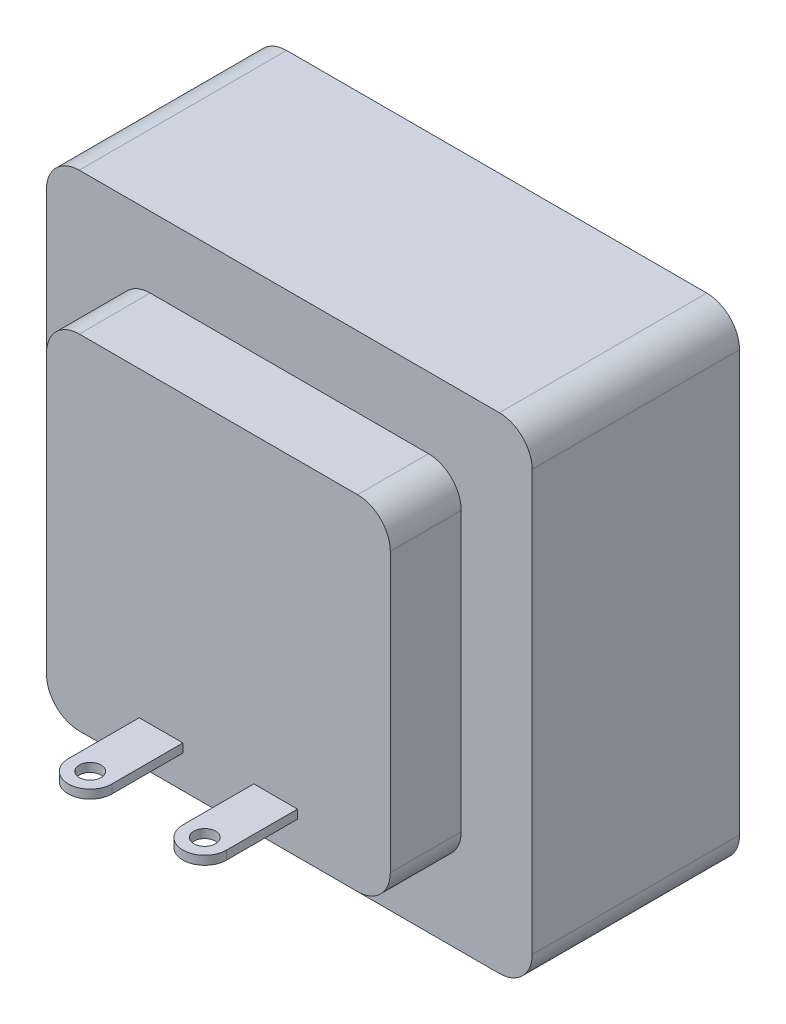
ISO-10303-21;
HEADER;
FILE_DESCRIPTION(('STEP AP214'),'2;1');
FILE_NAME('part.step','',(''),(''),'','','');
FILE_SCHEMA(('AUTOMOTIVE_DESIGN { 1 0 10303 214 1 1 1 1 }'));
ENDSEC;
DATA;
#1=APPLICATION_CONTEXT('core data for automotive mechanical design processes');
#2=APPLICATION_PROTOCOL_DEFINITION('international standard','automotive_design',2000,#1);
#3=PRODUCT_CONTEXT('',#1,'mechanical');
#4=PRODUCT('Part','Part','',(#3));
#5=PRODUCT_RELATED_PRODUCT_CATEGORY('part','',(#4));
#6=PRODUCT_DEFINITION_FORMATION('','',#4);
#7=PRODUCT_DEFINITION_CONTEXT('part definition',#1,'design');
#8=PRODUCT_DEFINITION('design','',#6,#7);
#9=PRODUCT_DEFINITION_SHAPE('','',#8);
#10=(LENGTH_UNIT() NAMED_UNIT(*) SI_UNIT(.MILLI.,.METRE.));
#11=(NAMED_UNIT(*) PLANE_ANGLE_UNIT() SI_UNIT($,.RADIAN.));
#12=(NAMED_UNIT(*) SI_UNIT($,.STERADIAN.) SOLID_ANGLE_UNIT());
#13=UNCERTAINTY_MEASURE_WITH_UNIT(LENGTH_MEASURE(1.E-05),#10,'distance_accuracy_value','');
#14=(GEOMETRIC_REPRESENTATION_CONTEXT(3) GLOBAL_UNCERTAINTY_ASSIGNED_CONTEXT((#13)) GLOBAL_UNIT_ASSIGNED_CONTEXT((#10,
#11,#12)) REPRESENTATION_CONTEXT('',''));
#15=CARTESIAN_POINT('',(0.,0.,0.));
#16=DIRECTION('',(0.,0.,1.));
#17=DIRECTION('',(1.,0.,0.));
#18=AXIS2_PLACEMENT_3D('',#15,#16,#17);
#19=CARTESIAN_POINT('',(67.1526725262539,15.75,16.));
#20=DIRECTION('',(0.,0.,-1.));
#21=DIRECTION('',(-1.,0.,0.));
#22=AXIS2_PLACEMENT_3D('',#19,#20,#21);
#23=PLANE('',#22);
#24=DIRECTION('',(0.,-1.,0.));
#25=VECTOR('',#24,1.);
#26=CARTESIAN_POINT('',(-7.25,-12.75,16.));
#27=LINE('',#26,#25);
#28=CARTESIAN_POINT('',(-7.25,-11.95,16.));
#29=VERTEX_POINT('',#28);
#30=CARTESIAN_POINT('',(-7.24999999999999,-12.75,16.));
#31=VERTEX_POINT('',#30);
#32=EDGE_CURVE('E304',#29,#31,#27,.T.);
#33=ORIENTED_EDGE('',*,*,#32,.F.);
#34=DIRECTION('',(-1.,0.,0.));
#35=VECTOR('',#34,1.);
#36=CARTESIAN_POINT('',(-7.25,-11.95,16.));
#37=LINE('',#36,#35);
#38=CARTESIAN_POINT('',(-3.25,-11.95,16.));
#39=VERTEX_POINT('',#38);
#40=EDGE_CURVE('E305',#39,#29,#37,.T.);
#41=ORIENTED_EDGE('',*,*,#40,.F.);
#42=DIRECTION('',(0.,1.,0.));
#43=VECTOR('',#42,1.);
#44=CARTESIAN_POINT('',(-3.25,-12.75,16.));
#45=LINE('',#44,#43);
#46=CARTESIAN_POINT('',(-3.25,-12.75,16.));
#47=VERTEX_POINT('',#46);
#48=EDGE_CURVE('E310',#47,#39,#45,.T.);
#49=ORIENTED_EDGE('',*,*,#48,.F.);
#50=DIRECTION('',(1.,0.,0.));
#51=VECTOR('',#50,1.);
#52=CARTESIAN_POINT('',(-7.25,-12.75,16.));
#53=LINE('',#52,#51);
#54=EDGE_CURVE('E261',#31,#47,#53,.T.);
#55=ORIENTED_EDGE('',*,*,#54,.F.);
#56=EDGE_LOOP('',(#33,#41,#49,#55));
#57=FACE_BOUND('',#56,.T.);
#58=DIRECTION('',(0.,1.,0.));
#59=VECTOR('',#58,1.);
#60=CARTESIAN_POINT('',(-15.75,15.75,16.));
#61=LINE('',#60,#59);
#62=CARTESIAN_POINT('',(-15.75,-12.75,16.));
#63=VERTEX_POINT('',#62);
#64=CARTESIAN_POINT('',(-15.75,12.75,16.));
#65=VERTEX_POINT('',#64);
#66=EDGE_CURVE('E321',#63,#65,#61,.T.);
#67=ORIENTED_EDGE('',*,*,#66,.F.);
#68=CARTESIAN_POINT('',(-12.75,-12.75,16.));
#69=DIRECTION('',(0.,0.,-1.));
#70=DIRECTION('',(-1.,0.,0.));
#71=AXIS2_PLACEMENT_3D('',#68,#69,#70);
#72=CIRCLE('',#71,3.);
#73=CARTESIAN_POINT('',(-12.75,-15.75,16.));
#74=VERTEX_POINT('',#73);
#75=EDGE_CURVE('E452',#63,#74,#72,.F.);
#76=ORIENTED_EDGE('',*,*,#75,.T.);
#77=DIRECTION('',(-1.,0.,0.));
#78=VECTOR('',#77,1.);
#79=CARTESIAN_POINT('',(67.1526725262539,-15.75,16.));
#80=LINE('',#79,#78);
#81=CARTESIAN_POINT('',(12.75,-15.75,16.));
#82=VERTEX_POINT('',#81);
#83=EDGE_CURVE('E329',#82,#74,#80,.T.);
#84=ORIENTED_EDGE('',*,*,#83,.F.);
#85=CARTESIAN_POINT('',(12.75,-12.75,16.));
#86=DIRECTION('',(0.,0.,-1.));
#87=DIRECTION('',(-1.,0.,0.));
#88=AXIS2_PLACEMENT_3D('',#85,#86,#87);
#89=CIRCLE('',#88,3.);
#90=CARTESIAN_POINT('',(15.75,-12.75,16.));
#91=VERTEX_POINT('',#90);
#92=EDGE_CURVE('E450',#82,#91,#89,.F.);
#93=ORIENTED_EDGE('',*,*,#92,.T.);
#94=DIRECTION('',(0.,1.,0.));
#95=VECTOR('',#94,1.);
#96=CARTESIAN_POINT('',(15.75,15.75,16.));
#97=LINE('',#96,#95);
#98=CARTESIAN_POINT('',(15.75,12.75,16.));
#99=VERTEX_POINT('',#98);
#100=EDGE_CURVE('E328',#91,#99,#97,.T.);
#101=ORIENTED_EDGE('',*,*,#100,.T.);
#102=CARTESIAN_POINT('',(12.75,12.75,16.));
#103=DIRECTION('',(0.,0.,-1.));
#104=DIRECTION('',(-1.,0.,0.));
#105=AXIS2_PLACEMENT_3D('',#102,#103,#104);
#106=CIRCLE('',#105,3.);
#107=CARTESIAN_POINT('',(12.75,15.75,16.));
#108=VERTEX_POINT('',#107);
#109=EDGE_CURVE('E446',#99,#108,#106,.F.);
#110=ORIENTED_EDGE('',*,*,#109,.T.);
#111=DIRECTION('',(-1.,0.,0.));
#112=VECTOR('',#111,1.);
#113=CARTESIAN_POINT('',(67.1526725262539,15.75,16.));
#114=LINE('',#113,#112);
#115=CARTESIAN_POINT('',(-12.75,15.75,16.));
#116=VERTEX_POINT('',#115);
#117=EDGE_CURVE('E324',#108,#116,#114,.T.);
#118=ORIENTED_EDGE('',*,*,#117,.T.);
#119=CARTESIAN_POINT('',(-12.75,12.75,16.));
#120=DIRECTION('',(0.,0.,-1.));
#121=DIRECTION('',(-1.,0.,0.));
#122=AXIS2_PLACEMENT_3D('',#119,#120,#121);
#123=CIRCLE('',#122,3.);
#124=EDGE_CURVE('E448',#116,#65,#123,.F.);
#125=ORIENTED_EDGE('',*,*,#124,.T.);
#126=EDGE_LOOP('',(#67,#76,#84,#93,#101,#110,#118,#125));
#127=FACE_BOUND('',#126,.T.);
#128=DIRECTION('',(1.,0.,0.));
#129=VECTOR('',#128,1.);
#130=CARTESIAN_POINT('',(7.25,-12.75,16.));
#131=LINE('',#130,#129);
#132=CARTESIAN_POINT('',(3.25,-12.75,16.));
#133=VERTEX_POINT('',#132);
#134=CARTESIAN_POINT('',(7.25000000000001,-12.75,16.));
#135=VERTEX_POINT('',#134);
#136=EDGE_CURVE('E278',#133,#135,#131,.T.);
#137=ORIENTED_EDGE('',*,*,#136,.F.);
#138=DIRECTION('',(0.,-1.,0.));
#139=VECTOR('',#138,1.);
#140=CARTESIAN_POINT('',(3.25,-12.75,16.));
#141=LINE('',#140,#139);
#142=CARTESIAN_POINT('',(3.25,-11.95,16.));
#143=VERTEX_POINT('',#142);
#144=EDGE_CURVE('E284',#143,#133,#141,.T.);
#145=ORIENTED_EDGE('',*,*,#144,.F.);
#146=DIRECTION('',(-1.,0.,0.));
#147=VECTOR('',#146,1.);
#148=CARTESIAN_POINT('',(7.25,-11.95,16.));
#149=LINE('',#148,#147);
#150=CARTESIAN_POINT('',(7.25,-11.95,16.));
#151=VERTEX_POINT('',#150);
#152=EDGE_CURVE('E54',#151,#143,#149,.T.);
#153=ORIENTED_EDGE('',*,*,#152,.F.);
#154=DIRECTION('',(0.,1.,0.));
#155=VECTOR('',#154,1.);
#156=CARTESIAN_POINT('',(7.25,-12.75,16.));
#157=LINE('',#156,#155);
#158=EDGE_CURVE('E49',#135,#151,#157,.T.);
#159=ORIENTED_EDGE('',*,*,#158,.F.);
#160=EDGE_LOOP('',(#137,#145,#153,#159));
#161=FACE_BOUND('',#160,.T.);
#162=ADVANCED_FACE('F34',(#57,#127,#161),#23,.F.);
#163=CARTESIAN_POINT('',(-22.25,-22.25,9.5));
#164=DIRECTION('',(0.,0.,1.));
#165=DIRECTION('',(1.,0.,0.));
#166=AXIS2_PLACEMENT_3D('',#163,#164,#165);
#167=PLANE('',#166);
#168=DIRECTION('',(0.,-1.,0.));
#169=VECTOR('',#168,1.);
#170=CARTESIAN_POINT('',(-22.25,22.25,9.5));
#171=LINE('',#170,#169);
#172=CARTESIAN_POINT('',(-22.25,19.25,9.5));
#173=VERTEX_POINT('',#172);
#174=CARTESIAN_POINT('',(-22.25,-19.25,9.5));
#175=VERTEX_POINT('',#174);
#176=EDGE_CURVE('E355',#173,#175,#171,.T.);
#177=ORIENTED_EDGE('',*,*,#176,.T.);
#178=CARTESIAN_POINT('',(-19.25,-19.25,9.5));
#179=DIRECTION('',(0.,0.,1.));
#180=DIRECTION('',(1.,0.,0.));
#181=AXIS2_PLACEMENT_3D('',#178,#179,#180);
#182=CIRCLE('',#181,3.);
#183=CARTESIAN_POINT('',(-19.25,-22.25,9.5));
#184=VERTEX_POINT('',#183);
#185=EDGE_CURVE('E414',#175,#184,#182,.T.);
#186=ORIENTED_EDGE('',*,*,#185,.T.);
#187=DIRECTION('',(1.,0.,0.));
#188=VECTOR('',#187,1.);
#189=CARTESIAN_POINT('',(-22.25,-22.25,9.5));
#190=LINE('',#189,#188);
#191=CARTESIAN_POINT('',(19.25,-22.25,9.5));
#192=VERTEX_POINT('',#191);
#193=EDGE_CURVE('E358',#184,#192,#190,.T.);
#194=ORIENTED_EDGE('',*,*,#193,.T.);
#195=CARTESIAN_POINT('',(19.25,-19.25,9.5));
#196=DIRECTION('',(0.,0.,1.));
#197=DIRECTION('',(1.,0.,0.));
#198=AXIS2_PLACEMENT_3D('',#195,#196,#197);
#199=CIRCLE('',#198,3.);
#200=CARTESIAN_POINT('',(22.25,-19.25,9.5));
#201=VERTEX_POINT('',#200);
#202=EDGE_CURVE('E412',#192,#201,#199,.T.);
#203=ORIENTED_EDGE('',*,*,#202,.T.);
#204=DIRECTION('',(0.,1.,0.));
#205=VECTOR('',#204,1.);
#206=CARTESIAN_POINT('',(22.25,22.25,9.5));
#207=LINE('',#206,#205);
#208=CARTESIAN_POINT('',(22.25,19.25,9.5));
#209=VERTEX_POINT('',#208);
#210=EDGE_CURVE('E362',#201,#209,#207,.T.);
#211=ORIENTED_EDGE('',*,*,#210,.T.);
#212=CARTESIAN_POINT('',(19.25,19.25,9.5));
#213=DIRECTION('',(0.,0.,1.));
#214=DIRECTION('',(1.,0.,0.));
#215=AXIS2_PLACEMENT_3D('',#212,#213,#214);
#216=CIRCLE('',#215,3.);
#217=CARTESIAN_POINT('',(19.25,22.25,9.5));
#218=VERTEX_POINT('',#217);
#219=EDGE_CURVE('E408',#209,#218,#216,.T.);
#220=ORIENTED_EDGE('',*,*,#219,.T.);
#221=DIRECTION('',(-1.,0.,0.));
#222=VECTOR('',#221,1.);
#223=CARTESIAN_POINT('',(-22.25,22.25,9.5));
#224=LINE('',#223,#222);
#225=CARTESIAN_POINT('',(-19.25,22.25,9.5));
#226=VERTEX_POINT('',#225);
#227=EDGE_CURVE('E365',#218,#226,#224,.T.);
#228=ORIENTED_EDGE('',*,*,#227,.T.);
#229=CARTESIAN_POINT('',(-19.25,19.25,9.5));
#230=DIRECTION('',(0.,0.,1.));
#231=DIRECTION('',(1.,0.,0.));
#232=AXIS2_PLACEMENT_3D('',#229,#230,#231);
#233=CIRCLE('',#232,3.);
#234=EDGE_CURVE('E410',#226,#173,#233,.T.);
#235=ORIENTED_EDGE('',*,*,#234,.T.);
#236=EDGE_LOOP('',(#177,#186,#194,#203,#211,#220,#228,#235));
#237=FACE_BOUND('',#236,.T.);
#238=DIRECTION('',(0.,1.,0.));
#239=VECTOR('',#238,1.);
#240=CARTESIAN_POINT('',(-15.75,-22.25,9.5));
#241=LINE('',#240,#239);
#242=CARTESIAN_POINT('',(-15.75,-12.75,9.5));
#243=VERTEX_POINT('',#242);
#244=CARTESIAN_POINT('',(-15.75,12.75,9.5));
#245=VERTEX_POINT('',#244);
#246=EDGE_CURVE('E332',#243,#245,#241,.T.);
#247=ORIENTED_EDGE('',*,*,#246,.T.);
#248=CARTESIAN_POINT('',(-12.75,12.75,9.5));
#249=DIRECTION('',(0.,0.,1.));
#250=DIRECTION('',(1.,0.,0.));
#251=AXIS2_PLACEMENT_3D('',#248,#249,#250);
#252=CIRCLE('',#251,3.);
#253=CARTESIAN_POINT('',(-12.75,15.75,9.5));
#254=VERTEX_POINT('',#253);
#255=EDGE_CURVE('E492',#245,#254,#252,.F.);
#256=ORIENTED_EDGE('',*,*,#255,.T.);
#257=DIRECTION('',(1.,0.,0.));
#258=VECTOR('',#257,1.);
#259=CARTESIAN_POINT('',(-22.25,15.75,9.5));
#260=LINE('',#259,#258);
#261=CARTESIAN_POINT('',(12.75,15.75,9.5));
#262=VERTEX_POINT('',#261);
#263=EDGE_CURVE('E351',#254,#262,#260,.T.);
#264=ORIENTED_EDGE('',*,*,#263,.T.);
#265=CARTESIAN_POINT('',(12.75,12.75,9.5));
#266=DIRECTION('',(0.,0.,1.));
#267=DIRECTION('',(1.,0.,0.));
#268=AXIS2_PLACEMENT_3D('',#265,#266,#267);
#269=CIRCLE('',#268,3.);
#270=CARTESIAN_POINT('',(15.75,12.75,9.5));
#271=VERTEX_POINT('',#270);
#272=EDGE_CURVE('E42',#262,#271,#269,.F.);
#273=ORIENTED_EDGE('',*,*,#272,.T.);
#274=DIRECTION('',(0.,-1.,0.));
#275=VECTOR('',#274,1.);
#276=CARTESIAN_POINT('',(15.75,-22.25,9.5));
#277=LINE('',#276,#275);
#278=CARTESIAN_POINT('',(15.75,-12.75,9.5));
#279=VERTEX_POINT('',#278);
#280=EDGE_CURVE('E345',#271,#279,#277,.T.);
#281=ORIENTED_EDGE('',*,*,#280,.T.);
#282=CARTESIAN_POINT('',(12.75,-12.75,9.5));
#283=DIRECTION('',(0.,0.,1.));
#284=DIRECTION('',(1.,0.,0.));
#285=AXIS2_PLACEMENT_3D('',#282,#283,#284);
#286=CIRCLE('',#285,3.);
#287=CARTESIAN_POINT('',(12.75,-15.75,9.5));
#288=VERTEX_POINT('',#287);
#289=EDGE_CURVE('E488',#279,#288,#286,.F.);
#290=ORIENTED_EDGE('',*,*,#289,.T.);
#291=DIRECTION('',(-1.,0.,0.));
#292=VECTOR('',#291,1.);
#293=CARTESIAN_POINT('',(-22.25,-15.75,9.5));
#294=LINE('',#293,#292);
#295=CARTESIAN_POINT('',(-12.75,-15.75,9.5));
#296=VERTEX_POINT('',#295);
#297=EDGE_CURVE('E348',#288,#296,#294,.T.);
#298=ORIENTED_EDGE('',*,*,#297,.T.);
#299=CARTESIAN_POINT('',(-12.75,-12.75,9.5));
#300=DIRECTION('',(0.,0.,1.));
#301=DIRECTION('',(1.,0.,0.));
#302=AXIS2_PLACEMENT_3D('',#299,#300,#301);
#303=CIRCLE('',#302,3.);
#304=EDGE_CURVE('E484',#296,#243,#303,.F.);
#305=ORIENTED_EDGE('',*,*,#304,.T.);
#306=EDGE_LOOP('',(#247,#256,#264,#273,#281,#290,#298,#305));
#307=FACE_BOUND('',#306,.T.);
#308=ADVANCED_FACE('F495',(#237,#307),#167,.T.);
#309=CARTESIAN_POINT('',(-22.25,-22.25,-9.5));
#310=DIRECTION('',(0.,0.,1.));
#311=DIRECTION('',(1.,0.,0.));
#312=AXIS2_PLACEMENT_3D('',#309,#310,#311);
#313=PLANE('',#312);
#314=DIRECTION('',(1.,0.,0.));
#315=VECTOR('',#314,1.);
#316=CARTESIAN_POINT('',(-22.25,-22.25,-9.5));
#317=LINE('',#316,#315);
#318=CARTESIAN_POINT('',(-19.25,-22.25,-9.5));
#319=VERTEX_POINT('',#318);
#320=CARTESIAN_POINT('',(19.25,-22.25,-9.5));
#321=VERTEX_POINT('',#320);
#322=EDGE_CURVE('E371',#319,#321,#317,.T.);
#323=ORIENTED_EDGE('',*,*,#322,.F.);
#324=CARTESIAN_POINT('',(-19.25,-19.25,-9.5));
#325=DIRECTION('',(0.,0.,1.));
#326=DIRECTION('',(1.,0.,0.));
#327=AXIS2_PLACEMENT_3D('',#324,#325,#326);
#328=CIRCLE('',#327,3.);
#329=CARTESIAN_POINT('',(-22.25,-19.25,-9.5));
#330=VERTEX_POINT('',#329);
#331=EDGE_CURVE('E401',#319,#330,#328,.F.);
#332=ORIENTED_EDGE('',*,*,#331,.T.);
#333=DIRECTION('',(0.,-1.,0.));
#334=VECTOR('',#333,1.);
#335=CARTESIAN_POINT('',(-22.25,22.25,-9.5));
#336=LINE('',#335,#334);
#337=CARTESIAN_POINT('',(-22.25,19.25,-9.5));
#338=VERTEX_POINT('',#337);
#339=EDGE_CURVE('E354',#338,#330,#336,.T.);
#340=ORIENTED_EDGE('',*,*,#339,.F.);
#341=CARTESIAN_POINT('',(-19.25,19.25,-9.5));
#342=DIRECTION('',(0.,0.,1.));
#343=DIRECTION('',(1.,0.,0.));
#344=AXIS2_PLACEMENT_3D('',#341,#342,#343);
#345=CIRCLE('',#344,3.);
#346=CARTESIAN_POINT('',(-19.25,22.25,-9.5));
#347=VERTEX_POINT('',#346);
#348=EDGE_CURVE('E397',#338,#347,#345,.F.);
#349=ORIENTED_EDGE('',*,*,#348,.T.);
#350=DIRECTION('',(-1.,0.,0.));
#351=VECTOR('',#350,1.);
#352=CARTESIAN_POINT('',(-22.25,22.25,-9.5));
#353=LINE('',#352,#351);
#354=CARTESIAN_POINT('',(19.25,22.25,-9.5));
#355=VERTEX_POINT('',#354);
#356=EDGE_CURVE('E359',#355,#347,#353,.T.);
#357=ORIENTED_EDGE('',*,*,#356,.F.);
#358=CARTESIAN_POINT('',(19.25,19.25,-9.5));
#359=DIRECTION('',(0.,0.,1.));
#360=DIRECTION('',(1.,0.,0.));
#361=AXIS2_PLACEMENT_3D('',#358,#359,#360);
#362=CIRCLE('',#361,3.);
#363=CARTESIAN_POINT('',(22.25,19.25,-9.5));
#364=VERTEX_POINT('',#363);
#365=EDGE_CURVE('E395',#355,#364,#362,.F.);
#366=ORIENTED_EDGE('',*,*,#365,.T.);
#367=DIRECTION('',(0.,1.,0.));
#368=VECTOR('',#367,1.);
#369=CARTESIAN_POINT('',(22.25,22.25,-9.5));
#370=LINE('',#369,#368);
#371=CARTESIAN_POINT('',(22.25,-19.25,-9.5));
#372=VERTEX_POINT('',#371);
#373=EDGE_CURVE('E374',#372,#364,#370,.T.);
#374=ORIENTED_EDGE('',*,*,#373,.F.);
#375=CARTESIAN_POINT('',(19.25,-19.25,-9.5));
#376=DIRECTION('',(0.,0.,1.));
#377=DIRECTION('',(1.,0.,0.));
#378=AXIS2_PLACEMENT_3D('',#375,#376,#377);
#379=CIRCLE('',#378,3.);
#380=EDGE_CURVE('E399',#372,#321,#379,.F.);
#381=ORIENTED_EDGE('',*,*,#380,.T.);
#382=EDGE_LOOP('',(#323,#332,#340,#349,#357,#366,#374,#381));
#383=FACE_BOUND('',#382,.T.);
#384=DIRECTION('',(0.,-1.,0.));
#385=VECTOR('',#384,1.);
#386=CARTESIAN_POINT('',(15.75,-22.25,-9.5));
#387=LINE('',#386,#385);
#388=CARTESIAN_POINT('',(15.75,12.75,-9.5));
#389=VERTEX_POINT('',#388);
#390=CARTESIAN_POINT('',(15.75,-12.75,-9.5));
#391=VERTEX_POINT('',#390);
#392=EDGE_CURVE('E387',#389,#391,#387,.T.);
#393=ORIENTED_EDGE('',*,*,#392,.F.);
#394=CARTESIAN_POINT('',(12.75,12.75,-9.5));
#395=DIRECTION('',(0.,0.,1.));
#396=DIRECTION('',(1.,0.,0.));
#397=AXIS2_PLACEMENT_3D('',#394,#395,#396);
#398=CIRCLE('',#397,3.);
#399=CARTESIAN_POINT('',(12.75,15.75,-9.5));
#400=VERTEX_POINT('',#399);
#401=EDGE_CURVE('E12',#389,#400,#398,.T.);
#402=ORIENTED_EDGE('',*,*,#401,.T.);
#403=DIRECTION('',(1.,0.,0.));
#404=VECTOR('',#403,1.);
#405=CARTESIAN_POINT('',(-22.25,15.75,-9.5));
#406=LINE('',#405,#404);
#407=CARTESIAN_POINT('',(-12.75,15.75,-9.5));
#408=VERTEX_POINT('',#407);
#409=EDGE_CURVE('E384',#408,#400,#406,.T.);
#410=ORIENTED_EDGE('',*,*,#409,.F.);
#411=CARTESIAN_POINT('',(-12.75,12.75,-9.5));
#412=DIRECTION('',(0.,0.,1.));
#413=DIRECTION('',(1.,0.,0.));
#414=AXIS2_PLACEMENT_3D('',#411,#412,#413);
#415=CIRCLE('',#414,3.);
#416=CARTESIAN_POINT('',(-15.75,12.75,-9.5));
#417=VERTEX_POINT('',#416);
#418=EDGE_CURVE('E490',#408,#417,#415,.T.);
#419=ORIENTED_EDGE('',*,*,#418,.T.);
#420=DIRECTION('',(0.,1.,0.));
#421=VECTOR('',#420,1.);
#422=CARTESIAN_POINT('',(-15.75,-22.25,-9.5));
#423=LINE('',#422,#421);
#424=CARTESIAN_POINT('',(-15.75,-12.75,-9.5));
#425=VERTEX_POINT('',#424);
#426=EDGE_CURVE('E368',#425,#417,#423,.T.);
#427=ORIENTED_EDGE('',*,*,#426,.F.);
#428=CARTESIAN_POINT('',(-12.75,-12.75,-9.5));
#429=DIRECTION('',(0.,0.,1.));
#430=DIRECTION('',(1.,0.,0.));
#431=AXIS2_PLACEMENT_3D('',#428,#429,#430);
#432=CIRCLE('',#431,3.);
#433=CARTESIAN_POINT('',(-12.75,-15.75,-9.5));
#434=VERTEX_POINT('',#433);
#435=EDGE_CURVE('E482',#425,#434,#432,.T.);
#436=ORIENTED_EDGE('',*,*,#435,.T.);
#437=DIRECTION('',(-1.,0.,0.));
#438=VECTOR('',#437,1.);
#439=CARTESIAN_POINT('',(-22.25,-15.75,-9.5));
#440=LINE('',#439,#438);
#441=CARTESIAN_POINT('',(12.75,-15.75,-9.5));
#442=VERTEX_POINT('',#441);
#443=EDGE_CURVE('E381',#442,#434,#440,.T.);
#444=ORIENTED_EDGE('',*,*,#443,.F.);
#445=CARTESIAN_POINT('',(12.75,-12.75,-9.5));
#446=DIRECTION('',(0.,0.,1.));
#447=DIRECTION('',(1.,0.,0.));
#448=AXIS2_PLACEMENT_3D('',#445,#446,#447);
#449=CIRCLE('',#448,3.);
#450=EDGE_CURVE('E486',#442,#391,#449,.T.);
#451=ORIENTED_EDGE('',*,*,#450,.T.);
#452=EDGE_LOOP('',(#393,#402,#410,#419,#427,#436,#444,#451));
#453=FACE_BOUND('',#452,.T.);
#454=ADVANCED_FACE('F551',(#383,#453),#313,.F.);
#455=CARTESIAN_POINT('',(-22.25,22.25,9.5));
#456=DIRECTION('',(1.,0.,0.));
#457=DIRECTION('',(0.,1.,0.));
#458=AXIS2_PLACEMENT_3D('',#455,#456,#457);
#459=PLANE('',#458);
#460=ORIENTED_EDGE('',*,*,#339,.T.);
#461=DIRECTION('',(0.,0.,-1.));
#462=VECTOR('',#461,1.);
#463=CARTESIAN_POINT('',(-22.25,-19.25,9.5));
#464=LINE('',#463,#462);
#465=EDGE_CURVE('E406',#330,#175,#464,.F.);
#466=ORIENTED_EDGE('',*,*,#465,.T.);
#467=ORIENTED_EDGE('',*,*,#176,.F.);
#468=DIRECTION('',(0.,0.,-1.));
#469=VECTOR('',#468,1.);
#470=CARTESIAN_POINT('',(-22.25,19.25,9.5));
#471=LINE('',#470,#469);
#472=EDGE_CURVE('E403',#173,#338,#471,.T.);
#473=ORIENTED_EDGE('',*,*,#472,.T.);
#474=EDGE_LOOP('',(#460,#466,#467,#473));
#475=FACE_BOUND('',#474,.T.);
#476=ADVANCED_FACE('F559',(#475),#459,.F.);
#477=CARTESIAN_POINT('',(-22.25,-22.25,9.5));
#478=DIRECTION('',(0.,1.,0.));
#479=DIRECTION('',(0.,0.,1.));
#480=AXIS2_PLACEMENT_3D('',#477,#478,#479);
#481=PLANE('',#480);
#482=ORIENTED_EDGE('',*,*,#193,.F.);
#483=DIRECTION('',(0.,0.,-1.));
#484=VECTOR('',#483,1.);
#485=CARTESIAN_POINT('',(-19.25,-22.25,9.5));
#486=LINE('',#485,#484);
#487=EDGE_CURVE('E392',#184,#319,#486,.T.);
#488=ORIENTED_EDGE('',*,*,#487,.T.);
#489=ORIENTED_EDGE('',*,*,#322,.T.);
#490=DIRECTION('',(0.,0.,-1.));
#491=VECTOR('',#490,1.);
#492=CARTESIAN_POINT('',(19.25,-22.25,9.5));
#493=LINE('',#492,#491);
#494=EDGE_CURVE('E390',#321,#192,#493,.F.);
#495=ORIENTED_EDGE('',*,*,#494,.T.);
#496=EDGE_LOOP('',(#482,#488,#489,#495));
#497=FACE_BOUND('',#496,.T.);
#498=ADVANCED_FACE('F569',(#497),#481,.F.);
#499=CARTESIAN_POINT('',(22.25,22.25,9.5));
#500=DIRECTION('',(-1.,0.,0.));
#501=DIRECTION('',(0.,-1.,0.));
#502=AXIS2_PLACEMENT_3D('',#499,#500,#501);
#503=PLANE('',#502);
#504=ORIENTED_EDGE('',*,*,#210,.F.);
#505=DIRECTION('',(0.,0.,-1.));
#506=VECTOR('',#505,1.);
#507=CARTESIAN_POINT('',(22.25,-19.25,9.5));
#508=LINE('',#507,#506);
#509=EDGE_CURVE('E418',#201,#372,#508,.T.);
#510=ORIENTED_EDGE('',*,*,#509,.T.);
#511=ORIENTED_EDGE('',*,*,#373,.T.);
#512=DIRECTION('',(0.,0.,-1.));
#513=VECTOR('',#512,1.);
#514=CARTESIAN_POINT('',(22.25,19.25,9.5));
#515=LINE('',#514,#513);
#516=EDGE_CURVE('E416',#364,#209,#515,.F.);
#517=ORIENTED_EDGE('',*,*,#516,.T.);
#518=EDGE_LOOP('',(#504,#510,#511,#517));
#519=FACE_BOUND('',#518,.T.);
#520=ADVANCED_FACE('F565',(#519),#503,.F.);
#521=CARTESIAN_POINT('',(-22.25,22.25,9.5));
#522=DIRECTION('',(0.,-1.,0.));
#523=DIRECTION('',(0.,0.,-1.));
#524=AXIS2_PLACEMENT_3D('',#521,#522,#523);
#525=PLANE('',#524);
#526=ORIENTED_EDGE('',*,*,#356,.T.);
#527=DIRECTION('',(0.,0.,-1.));
#528=VECTOR('',#527,1.);
#529=CARTESIAN_POINT('',(-19.25,22.25,9.5));
#530=LINE('',#529,#528);
#531=EDGE_CURVE('E475',#347,#226,#530,.F.);
#532=ORIENTED_EDGE('',*,*,#531,.T.);
#533=ORIENTED_EDGE('',*,*,#227,.F.);
#534=DIRECTION('',(0.,0.,-1.));
#535=VECTOR('',#534,1.);
#536=CARTESIAN_POINT('',(19.25,22.25,9.5));
#537=LINE('',#536,#535);
#538=EDGE_CURVE('E472',#218,#355,#537,.T.);
#539=ORIENTED_EDGE('',*,*,#538,.T.);
#540=EDGE_LOOP('',(#526,#532,#533,#539));
#541=FACE_BOUND('',#540,.T.);
#542=ADVANCED_FACE('F561',(#541),#525,.F.);
#543=CARTESIAN_POINT('',(67.1526725262539,15.75,-16.));
#544=DIRECTION('',(0.,0.,1.));
#545=DIRECTION('',(0.,-1.,0.));
#546=AXIS2_PLACEMENT_3D('',#543,#544,#545);
#547=PLANE('',#546);
#548=DIRECTION('',(-1.,0.,0.));
#549=VECTOR('',#548,1.);
#550=CARTESIAN_POINT('',(67.1526725262539,-15.75,-16.));
#551=LINE('',#550,#549);
#552=CARTESIAN_POINT('',(12.75,-15.75,-16.));
#553=VERTEX_POINT('',#552);
#554=CARTESIAN_POINT('',(-12.75,-15.75,-16.));
#555=VERTEX_POINT('',#554);
#556=EDGE_CURVE('E338',#553,#555,#551,.T.);
#557=ORIENTED_EDGE('',*,*,#556,.T.);
#558=CARTESIAN_POINT('',(-12.75,-12.75,-16.));
#559=DIRECTION('',(0.,0.,1.));
#560=DIRECTION('',(0.,-1.,0.));
#561=AXIS2_PLACEMENT_3D('',#558,#559,#560);
#562=CIRCLE('',#561,3.);
#563=CARTESIAN_POINT('',(-15.75,-12.75,-16.));
#564=VERTEX_POINT('',#563);
#565=EDGE_CURVE('E438',#555,#564,#562,.F.);
#566=ORIENTED_EDGE('',*,*,#565,.T.);
#567=DIRECTION('',(0.,-1.,0.));
#568=VECTOR('',#567,1.);
#569=CARTESIAN_POINT('',(-15.75,15.75,-16.));
#570=LINE('',#569,#568);
#571=CARTESIAN_POINT('',(-15.75,12.75,-16.));
#572=VERTEX_POINT('',#571);
#573=EDGE_CURVE('E318',#572,#564,#570,.T.);
#574=ORIENTED_EDGE('',*,*,#573,.F.);
#575=CARTESIAN_POINT('',(-12.75,12.75,-16.));
#576=DIRECTION('',(0.,0.,1.));
#577=DIRECTION('',(0.,-1.,0.));
#578=AXIS2_PLACEMENT_3D('',#575,#576,#577);
#579=CIRCLE('',#578,3.);
#580=CARTESIAN_POINT('',(-12.75,15.75,-16.));
#581=VERTEX_POINT('',#580);
#582=EDGE_CURVE('E434',#572,#581,#579,.F.);
#583=ORIENTED_EDGE('',*,*,#582,.T.);
#584=DIRECTION('',(-1.,0.,0.));
#585=VECTOR('',#584,1.);
#586=CARTESIAN_POINT('',(67.1526725262539,15.75,-16.));
#587=LINE('',#586,#585);
#588=CARTESIAN_POINT('',(12.75,15.75,-16.));
#589=VERTEX_POINT('',#588);
#590=EDGE_CURVE('E335',#589,#581,#587,.T.);
#591=ORIENTED_EDGE('',*,*,#590,.F.);
#592=CARTESIAN_POINT('',(12.75,12.75,-16.));
#593=DIRECTION('',(0.,0.,1.));
#594=DIRECTION('',(0.,-1.,0.));
#595=AXIS2_PLACEMENT_3D('',#592,#593,#594);
#596=CIRCLE('',#595,3.);
#597=CARTESIAN_POINT('',(15.75,12.75,-16.));
#598=VERTEX_POINT('',#597);
#599=EDGE_CURVE('E432',#589,#598,#596,.F.);
#600=ORIENTED_EDGE('',*,*,#599,.T.);
#601=DIRECTION('',(0.,-1.,0.));
#602=VECTOR('',#601,1.);
#603=CARTESIAN_POINT('',(15.75,15.75,-16.));
#604=LINE('',#603,#602);
#605=CARTESIAN_POINT('',(15.75,-12.75,-16.));
#606=VERTEX_POINT('',#605);
#607=EDGE_CURVE('E325',#598,#606,#604,.T.);
#608=ORIENTED_EDGE('',*,*,#607,.T.);
#609=CARTESIAN_POINT('',(12.75,-12.75,-16.));
#610=DIRECTION('',(0.,0.,1.));
#611=DIRECTION('',(0.,-1.,0.));
#612=AXIS2_PLACEMENT_3D('',#609,#610,#611);
#613=CIRCLE('',#612,3.);
#614=EDGE_CURVE('E436',#606,#553,#613,.F.);
#615=ORIENTED_EDGE('',*,*,#614,.T.);
#616=EDGE_LOOP('',(#557,#566,#574,#583,#591,#600,#608,#615));
#617=FACE_BOUND('',#616,.T.);
#618=ADVANCED_FACE('F564',(#617),#547,.F.);
#619=CARTESIAN_POINT('',(-15.75,22.25,9.5));
#620=DIRECTION('',(1.,0.,0.));
#621=DIRECTION('',(0.,1.,0.));
#622=AXIS2_PLACEMENT_3D('',#619,#620,#621);
#623=PLANE('',#622);
#624=ORIENTED_EDGE('',*,*,#573,.T.);
#625=DIRECTION('',(0.,0.,1.));
#626=VECTOR('',#625,1.);
#627=CARTESIAN_POINT('',(-15.75,-12.75,9.5));
#628=LINE('',#627,#626);
#629=EDGE_CURVE('E424',#564,#425,#628,.T.);
#630=ORIENTED_EDGE('',*,*,#629,.T.);
#631=ORIENTED_EDGE('',*,*,#426,.T.);
#632=DIRECTION('',(0.,0.,-1.));
#633=VECTOR('',#632,1.);
#634=CARTESIAN_POINT('',(-15.75,12.75,9.5));
#635=LINE('',#634,#633);
#636=EDGE_CURVE('E421',#417,#572,#635,.T.);
#637=ORIENTED_EDGE('',*,*,#636,.T.);
#638=EDGE_LOOP('',(#624,#630,#631,#637));
#639=FACE_BOUND('',#638,.T.);
#640=ADVANCED_FACE('F782',(#639),#623,.F.);
#641=CARTESIAN_POINT('',(15.75,22.25,9.5));
#642=DIRECTION('',(-1.,0.,0.));
#643=DIRECTION('',(0.,-1.,0.));
#644=AXIS2_PLACEMENT_3D('',#641,#642,#643);
#645=PLANE('',#644);
#646=ORIENTED_EDGE('',*,*,#392,.T.);
#647=DIRECTION('',(0.,0.,1.));
#648=VECTOR('',#647,1.);
#649=CARTESIAN_POINT('',(15.75,-12.75,9.5));
#650=LINE('',#649,#648);
#651=EDGE_CURVE('E461',#391,#606,#650,.F.);
#652=ORIENTED_EDGE('',*,*,#651,.T.);
#653=ORIENTED_EDGE('',*,*,#607,.F.);
#654=DIRECTION('',(0.,0.,-1.));
#655=VECTOR('',#654,1.);
#656=CARTESIAN_POINT('',(15.75,12.75,9.5));
#657=LINE('',#656,#655);
#658=EDGE_CURVE('E459',#598,#389,#657,.F.);
#659=ORIENTED_EDGE('',*,*,#658,.T.);
#660=EDGE_LOOP('',(#646,#652,#653,#659));
#661=FACE_BOUND('',#660,.T.);
#662=ADVANCED_FACE('F785',(#661),#645,.F.);
#663=CARTESIAN_POINT('',(67.1526725262539,-15.75,16.));
#664=DIRECTION('',(0.,1.,0.));
#665=DIRECTION('',(0.,0.,1.));
#666=AXIS2_PLACEMENT_3D('',#663,#664,#665);
#667=PLANE('',#666);
#668=ORIENTED_EDGE('',*,*,#443,.T.);
#669=DIRECTION('',(0.,0.,1.));
#670=VECTOR('',#669,1.);
#671=CARTESIAN_POINT('',(-12.75,-15.75,16.));
#672=LINE('',#671,#670);
#673=EDGE_CURVE('E430',#434,#555,#672,.F.);
#674=ORIENTED_EDGE('',*,*,#673,.T.);
#675=ORIENTED_EDGE('',*,*,#556,.F.);
#676=DIRECTION('',(0.,0.,1.));
#677=VECTOR('',#676,1.);
#678=CARTESIAN_POINT('',(12.75,-15.75,16.));
#679=LINE('',#678,#677);
#680=EDGE_CURVE('E427',#553,#442,#679,.T.);
#681=ORIENTED_EDGE('',*,*,#680,.T.);
#682=EDGE_LOOP('',(#668,#674,#675,#681));
#683=FACE_BOUND('',#682,.T.);
#684=ADVANCED_FACE('F818',(#683),#667,.F.);
#685=CARTESIAN_POINT('',(67.1526725262539,15.75,16.));
#686=DIRECTION('',(0.,-1.,0.));
#687=DIRECTION('',(0.,0.,-1.));
#688=AXIS2_PLACEMENT_3D('',#685,#686,#687);
#689=PLANE('',#688);
#690=ORIENTED_EDGE('',*,*,#590,.T.);
#691=DIRECTION('',(0.,0.,-1.));
#692=VECTOR('',#691,1.);
#693=CARTESIAN_POINT('',(-12.75,15.75,16.));
#694=LINE('',#693,#692);
#695=EDGE_CURVE('E470',#581,#408,#694,.F.);
#696=ORIENTED_EDGE('',*,*,#695,.T.);
#697=ORIENTED_EDGE('',*,*,#409,.T.);
#698=DIRECTION('',(0.,0.,-1.));
#699=VECTOR('',#698,1.);
#700=CARTESIAN_POINT('',(12.75,15.75,16.));
#701=LINE('',#700,#699);
#702=EDGE_CURVE('E467',#400,#589,#701,.T.);
#703=ORIENTED_EDGE('',*,*,#702,.T.);
#704=EDGE_LOOP('',(#690,#696,#697,#703));
#705=FACE_BOUND('',#704,.T.);
#706=ADVANCED_FACE('F787',(#705),#689,.F.);
#707=ORIENTED_EDGE('',*,*,#263,.F.);
#708=DIRECTION('',(0.,0.,-1.));
#709=VECTOR('',#708,1.);
#710=CARTESIAN_POINT('',(-12.75,15.75,16.));
#711=LINE('',#710,#709);
#712=EDGE_CURVE('E480',#254,#116,#711,.F.);
#713=ORIENTED_EDGE('',*,*,#712,.T.);
#714=ORIENTED_EDGE('',*,*,#117,.F.);
#715=DIRECTION('',(0.,0.,-1.));
#716=VECTOR('',#715,1.);
#717=CARTESIAN_POINT('',(12.75,15.75,16.));
#718=LINE('',#717,#716);
#719=EDGE_CURVE('E477',#108,#262,#718,.T.);
#720=ORIENTED_EDGE('',*,*,#719,.T.);
#721=EDGE_LOOP('',(#707,#713,#714,#720));
#722=FACE_BOUND('',#721,.T.);
#723=ADVANCED_FACE('F512',(#722),#689,.F.);
#724=ORIENTED_EDGE('',*,*,#83,.T.);
#725=DIRECTION('',(0.,0.,1.));
#726=VECTOR('',#725,1.);
#727=CARTESIAN_POINT('',(-12.75,-15.75,16.));
#728=LINE('',#727,#726);
#729=EDGE_CURVE('E457',#74,#296,#728,.F.);
#730=ORIENTED_EDGE('',*,*,#729,.T.);
#731=ORIENTED_EDGE('',*,*,#297,.F.);
#732=DIRECTION('',(0.,0.,1.));
#733=VECTOR('',#732,1.);
#734=CARTESIAN_POINT('',(12.75,-15.75,16.));
#735=LINE('',#734,#733);
#736=EDGE_CURVE('E454',#288,#82,#735,.T.);
#737=ORIENTED_EDGE('',*,*,#736,.T.);
#738=EDGE_LOOP('',(#724,#730,#731,#737));
#739=FACE_BOUND('',#738,.T.);
#740=ADVANCED_FACE('F527',(#739),#667,.F.);
#741=ORIENTED_EDGE('',*,*,#100,.F.);
#742=DIRECTION('',(0.,0.,1.));
#743=VECTOR('',#742,1.);
#744=CARTESIAN_POINT('',(15.75,-12.75,9.5));
#745=LINE('',#744,#743);
#746=EDGE_CURVE('E465',#91,#279,#745,.F.);
#747=ORIENTED_EDGE('',*,*,#746,.T.);
#748=ORIENTED_EDGE('',*,*,#280,.F.);
#749=DIRECTION('',(0.,0.,-1.));
#750=VECTOR('',#749,1.);
#751=CARTESIAN_POINT('',(15.75,12.75,9.5));
#752=LINE('',#751,#750);
#753=EDGE_CURVE('E463',#271,#99,#752,.F.);
#754=ORIENTED_EDGE('',*,*,#753,.T.);
#755=EDGE_LOOP('',(#741,#747,#748,#754));
#756=FACE_BOUND('',#755,.T.);
#757=ADVANCED_FACE('F503',(#756),#645,.F.);
#758=ORIENTED_EDGE('',*,*,#246,.F.);
#759=DIRECTION('',(0.,0.,1.));
#760=VECTOR('',#759,1.);
#761=CARTESIAN_POINT('',(-15.75,-12.75,9.5));
#762=LINE('',#761,#760);
#763=EDGE_CURVE('E443',#243,#63,#762,.T.);
#764=ORIENTED_EDGE('',*,*,#763,.T.);
#765=ORIENTED_EDGE('',*,*,#66,.T.);
#766=DIRECTION('',(0.,0.,-1.));
#767=VECTOR('',#766,1.);
#768=CARTESIAN_POINT('',(-15.75,12.75,9.5));
#769=LINE('',#768,#767);
#770=EDGE_CURVE('E440',#65,#245,#769,.T.);
#771=ORIENTED_EDGE('',*,*,#770,.T.);
#772=EDGE_LOOP('',(#758,#764,#765,#771));
#773=FACE_BOUND('',#772,.T.);
#774=ADVANCED_FACE('F519',(#773),#623,.F.);
#775=CARTESIAN_POINT('',(-19.25,-19.25,9.5));
#776=DIRECTION('',(0.,0.,-1.));
#777=DIRECTION('',(-1.,0.,0.));
#778=AXIS2_PLACEMENT_3D('',#775,#776,#777);
#779=CYLINDRICAL_SURFACE('',#778,3.);
#780=ORIENTED_EDGE('',*,*,#185,.F.);
#781=ORIENTED_EDGE('',*,*,#465,.F.);
#782=ORIENTED_EDGE('',*,*,#331,.F.);
#783=ORIENTED_EDGE('',*,*,#487,.F.);
#784=EDGE_LOOP('',(#780,#781,#782,#783));
#785=FACE_BOUND('',#784,.T.);
#786=ADVANCED_FACE('F577',(#785),#779,.T.);
#787=CARTESIAN_POINT('',(19.25,-19.25,9.5));
#788=DIRECTION('',(0.,0.,-1.));
#789=DIRECTION('',(-1.,0.,0.));
#790=AXIS2_PLACEMENT_3D('',#787,#788,#789);
#791=CYLINDRICAL_SURFACE('',#790,3.);
#792=ORIENTED_EDGE('',*,*,#202,.F.);
#793=ORIENTED_EDGE('',*,*,#494,.F.);
#794=ORIENTED_EDGE('',*,*,#380,.F.);
#795=ORIENTED_EDGE('',*,*,#509,.F.);
#796=EDGE_LOOP('',(#792,#793,#794,#795));
#797=FACE_BOUND('',#796,.T.);
#798=ADVANCED_FACE('F580',(#797),#791,.T.);
#799=CARTESIAN_POINT('',(-12.75,-12.75,9.5));
#800=DIRECTION('',(0.,0.,1.));
#801=DIRECTION('',(1.,0.,0.));
#802=AXIS2_PLACEMENT_3D('',#799,#800,#801);
#803=CYLINDRICAL_SURFACE('',#802,3.);
#804=ORIENTED_EDGE('',*,*,#565,.F.);
#805=ORIENTED_EDGE('',*,*,#673,.F.);
#806=ORIENTED_EDGE('',*,*,#435,.F.);
#807=ORIENTED_EDGE('',*,*,#629,.F.);
#808=EDGE_LOOP('',(#804,#805,#806,#807));
#809=FACE_BOUND('',#808,.T.);
#810=ADVANCED_FACE('F584',(#809),#803,.T.);
#811=CARTESIAN_POINT('',(-12.75,-12.75,9.5));
#812=DIRECTION('',(0.,0.,1.));
#813=DIRECTION('',(1.,0.,0.));
#814=AXIS2_PLACEMENT_3D('',#811,#812,#813);
#815=CYLINDRICAL_SURFACE('',#814,3.);
#816=ORIENTED_EDGE('',*,*,#304,.F.);
#817=ORIENTED_EDGE('',*,*,#729,.F.);
#818=ORIENTED_EDGE('',*,*,#75,.F.);
#819=ORIENTED_EDGE('',*,*,#763,.F.);
#820=EDGE_LOOP('',(#816,#817,#818,#819));
#821=FACE_BOUND('',#820,.T.);
#822=ADVANCED_FACE('F523',(#821),#815,.T.);
#823=CARTESIAN_POINT('',(12.75,-12.75,16.));
#824=DIRECTION('',(0.,0.,1.));
#825=DIRECTION('',(1.,0.,0.));
#826=AXIS2_PLACEMENT_3D('',#823,#824,#825);
#827=CYLINDRICAL_SURFACE('',#826,3.);
#828=ORIENTED_EDGE('',*,*,#614,.F.);
#829=ORIENTED_EDGE('',*,*,#651,.F.);
#830=ORIENTED_EDGE('',*,*,#450,.F.);
#831=ORIENTED_EDGE('',*,*,#680,.F.);
#832=EDGE_LOOP('',(#828,#829,#830,#831));
#833=FACE_BOUND('',#832,.T.);
#834=ADVANCED_FACE('F534',(#833),#827,.T.);
#835=CARTESIAN_POINT('',(12.75,-12.75,16.));
#836=DIRECTION('',(0.,0.,1.));
#837=DIRECTION('',(1.,0.,0.));
#838=AXIS2_PLACEMENT_3D('',#835,#836,#837);
#839=CYLINDRICAL_SURFACE('',#838,3.);
#840=ORIENTED_EDGE('',*,*,#289,.F.);
#841=ORIENTED_EDGE('',*,*,#746,.F.);
#842=ORIENTED_EDGE('',*,*,#92,.F.);
#843=ORIENTED_EDGE('',*,*,#736,.F.);
#844=EDGE_LOOP('',(#840,#841,#842,#843));
#845=FACE_BOUND('',#844,.T.);
#846=ADVANCED_FACE('F531',(#845),#839,.T.);
#847=CARTESIAN_POINT('',(-12.75,12.75,9.5));
#848=DIRECTION('',(0.,0.,-1.));
#849=DIRECTION('',(-1.,0.,0.));
#850=AXIS2_PLACEMENT_3D('',#847,#848,#849);
#851=CYLINDRICAL_SURFACE('',#850,3.);
#852=ORIENTED_EDGE('',*,*,#418,.F.);
#853=ORIENTED_EDGE('',*,*,#695,.F.);
#854=ORIENTED_EDGE('',*,*,#582,.F.);
#855=ORIENTED_EDGE('',*,*,#636,.F.);
#856=EDGE_LOOP('',(#852,#853,#854,#855));
#857=FACE_BOUND('',#856,.T.);
#858=ADVANCED_FACE('F533',(#857),#851,.T.);
#859=CARTESIAN_POINT('',(-19.25,19.25,9.5));
#860=DIRECTION('',(0.,0.,-1.));
#861=DIRECTION('',(-1.,0.,0.));
#862=AXIS2_PLACEMENT_3D('',#859,#860,#861);
#863=CYLINDRICAL_SURFACE('',#862,3.);
#864=ORIENTED_EDGE('',*,*,#234,.F.);
#865=ORIENTED_EDGE('',*,*,#531,.F.);
#866=ORIENTED_EDGE('',*,*,#348,.F.);
#867=ORIENTED_EDGE('',*,*,#472,.F.);
#868=EDGE_LOOP('',(#864,#865,#866,#867));
#869=FACE_BOUND('',#868,.T.);
#870=ADVANCED_FACE('F540',(#869),#863,.T.);
#871=CARTESIAN_POINT('',(-12.75,12.75,9.5));
#872=DIRECTION('',(0.,0.,-1.));
#873=DIRECTION('',(-1.,0.,0.));
#874=AXIS2_PLACEMENT_3D('',#871,#872,#873);
#875=CYLINDRICAL_SURFACE('',#874,3.);
#876=ORIENTED_EDGE('',*,*,#124,.F.);
#877=ORIENTED_EDGE('',*,*,#712,.F.);
#878=ORIENTED_EDGE('',*,*,#255,.F.);
#879=ORIENTED_EDGE('',*,*,#770,.F.);
#880=EDGE_LOOP('',(#876,#877,#878,#879));
#881=FACE_BOUND('',#880,.T.);
#882=ADVANCED_FACE('F515',(#881),#875,.T.);
#883=CARTESIAN_POINT('',(12.75,12.75,16.));
#884=DIRECTION('',(0.,0.,-1.));
#885=DIRECTION('',(-1.,0.,0.));
#886=AXIS2_PLACEMENT_3D('',#883,#884,#885);
#887=CYLINDRICAL_SURFACE('',#886,3.);
#888=ORIENTED_EDGE('',*,*,#109,.F.);
#889=ORIENTED_EDGE('',*,*,#753,.F.);
#890=ORIENTED_EDGE('',*,*,#272,.F.);
#891=ORIENTED_EDGE('',*,*,#719,.F.);
#892=EDGE_LOOP('',(#888,#889,#890,#891));
#893=FACE_BOUND('',#892,.T.);
#894=ADVANCED_FACE('F506',(#893),#887,.T.);
#895=CARTESIAN_POINT('',(19.25,19.25,9.5));
#896=DIRECTION('',(0.,0.,-1.));
#897=DIRECTION('',(-1.,0.,0.));
#898=AXIS2_PLACEMENT_3D('',#895,#896,#897);
#899=CYLINDRICAL_SURFACE('',#898,3.);
#900=ORIENTED_EDGE('',*,*,#219,.F.);
#901=ORIENTED_EDGE('',*,*,#516,.F.);
#902=ORIENTED_EDGE('',*,*,#365,.F.);
#903=ORIENTED_EDGE('',*,*,#538,.F.);
#904=EDGE_LOOP('',(#900,#901,#902,#903));
#905=FACE_BOUND('',#904,.T.);
#906=ADVANCED_FACE('F634',(#905),#899,.T.);
#907=CARTESIAN_POINT('',(12.75,12.75,16.));
#908=DIRECTION('',(0.,0.,-1.));
#909=DIRECTION('',(-1.,0.,0.));
#910=AXIS2_PLACEMENT_3D('',#907,#908,#909);
#911=CYLINDRICAL_SURFACE('',#910,3.);
#912=ORIENTED_EDGE('',*,*,#401,.F.);
#913=ORIENTED_EDGE('',*,*,#658,.F.);
#914=ORIENTED_EDGE('',*,*,#599,.F.);
#915=ORIENTED_EDGE('',*,*,#702,.F.);
#916=EDGE_LOOP('',(#912,#913,#914,#915));
#917=FACE_BOUND('',#916,.T.);
#918=ADVANCED_FACE('F36',(#917),#911,.T.);
#919=CARTESIAN_POINT('',(-7.25,-12.75,22.5));
#920=DIRECTION('',(1.,0.,0.));
#921=DIRECTION('',(0.,1.,0.));
#922=AXIS2_PLACEMENT_3D('',#919,#920,#921);
#923=PLANE('',#922);
#924=ORIENTED_EDGE('',*,*,#32,.T.);
#925=DIRECTION('',(0.,0.,-1.));
#926=VECTOR('',#925,1.);
#927=CARTESIAN_POINT('',(-7.25,-12.75,22.5));
#928=LINE('',#927,#926);
#929=CARTESIAN_POINT('',(-7.25,-12.75,22.5));
#930=VERTEX_POINT('',#929);
#931=EDGE_CURVE('E262',#930,#31,#928,.T.);
#932=ORIENTED_EDGE('',*,*,#931,.F.);
#933=DIRECTION('',(0.,-1.,0.));
#934=VECTOR('',#933,1.);
#935=CARTESIAN_POINT('',(-7.25,-12.75,22.5));
#936=LINE('',#935,#934);
#937=CARTESIAN_POINT('',(-7.25,-11.95,22.5));
#938=VERTEX_POINT('',#937);
#939=EDGE_CURVE('E252',#938,#930,#936,.T.);
#940=ORIENTED_EDGE('',*,*,#939,.F.);
#941=DIRECTION('',(0.,0.,-1.));
#942=VECTOR('',#941,1.);
#943=CARTESIAN_POINT('',(-7.25,-11.95,22.5));
#944=LINE('',#943,#942);
#945=EDGE_CURVE('E251',#938,#29,#944,.T.);
#946=ORIENTED_EDGE('',*,*,#945,.T.);
#947=EDGE_LOOP('',(#924,#932,#940,#946));
#948=FACE_BOUND('',#947,.T.);
#949=ADVANCED_FACE('F650',(#948),#923,.F.);
#950=CARTESIAN_POINT('',(-7.25,-12.75,22.5));
#951=DIRECTION('',(0.,1.,0.));
#952=DIRECTION('',(0.,0.,1.));
#953=AXIS2_PLACEMENT_3D('',#950,#951,#952);
#954=PLANE('',#953);
#955=CARTESIAN_POINT('',(-5.25,-12.75,22.5));
#956=DIRECTION('',(0.,1.,0.));
#957=DIRECTION('',(0.,0.,1.));
#958=AXIS2_PLACEMENT_3D('',#955,#956,#957);
#959=CIRCLE('',#958,1.);
#960=CARTESIAN_POINT('',(-5.25,-12.75,23.5));
#961=VERTEX_POINT('',#960);
#962=EDGE_CURVE('E272',#961,#961,#959,.T.);
#963=ORIENTED_EDGE('',*,*,#962,.T.);
#964=EDGE_LOOP('',(#963));
#965=FACE_BOUND('',#964,.T.);
#966=ORIENTED_EDGE('',*,*,#54,.T.);
#967=DIRECTION('',(0.,0.,-1.));
#968=VECTOR('',#967,1.);
#969=CARTESIAN_POINT('',(-3.25,-12.75,22.5));
#970=LINE('',#969,#968);
#971=CARTESIAN_POINT('',(-3.25,-12.75,22.5));
#972=VERTEX_POINT('',#971);
#973=EDGE_CURVE('E244',#972,#47,#970,.T.);
#974=ORIENTED_EDGE('',*,*,#973,.F.);
#975=CARTESIAN_POINT('',(-5.25,-12.75,22.5));
#976=DIRECTION('',(0.,1.,0.));
#977=DIRECTION('',(-1.,0.,0.));
#978=AXIS2_PLACEMENT_3D('',#975,#976,#977);
#979=CIRCLE('',#978,2.);
#980=EDGE_CURVE('E259',#972,#930,#979,.F.);
#981=ORIENTED_EDGE('',*,*,#980,.T.);
#982=ORIENTED_EDGE('',*,*,#931,.T.);
#983=EDGE_LOOP('',(#966,#974,#981,#982));
#984=FACE_BOUND('',#983,.T.);
#985=ADVANCED_FACE('F257',(#965,#984),#954,.F.);
#986=CARTESIAN_POINT('',(-3.25,-12.75,22.5));
#987=DIRECTION('',(-1.,0.,0.));
#988=DIRECTION('',(0.,-1.,0.));
#989=AXIS2_PLACEMENT_3D('',#986,#987,#988);
#990=PLANE('',#989);
#991=ORIENTED_EDGE('',*,*,#48,.T.);
#992=DIRECTION('',(0.,0.,-1.));
#993=VECTOR('',#992,1.);
#994=CARTESIAN_POINT('',(-3.25,-11.95,22.5));
#995=LINE('',#994,#993);
#996=CARTESIAN_POINT('',(-3.25,-11.95,22.5));
#997=VERTEX_POINT('',#996);
#998=EDGE_CURVE('E246',#997,#39,#995,.T.);
#999=ORIENTED_EDGE('',*,*,#998,.F.);
#1000=DIRECTION('',(0.,1.,0.));
#1001=VECTOR('',#1000,1.);
#1002=CARTESIAN_POINT('',(-3.25,-12.75,22.5));
#1003=LINE('',#1002,#1001);
#1004=EDGE_CURVE('E240',#972,#997,#1003,.T.);
#1005=ORIENTED_EDGE('',*,*,#1004,.F.);
#1006=ORIENTED_EDGE('',*,*,#973,.T.);
#1007=EDGE_LOOP('',(#991,#999,#1005,#1006));
#1008=FACE_BOUND('',#1007,.T.);
#1009=ADVANCED_FACE('F243',(#1008),#990,.F.);
#1010=CARTESIAN_POINT('',(-7.25,-11.95,22.5));
#1011=DIRECTION('',(0.,-1.,0.));
#1012=DIRECTION('',(0.,0.,-1.));
#1013=AXIS2_PLACEMENT_3D('',#1010,#1011,#1012);
#1014=PLANE('',#1013);
#1015=CARTESIAN_POINT('',(-5.25,-11.95,22.5));
#1016=DIRECTION('',(0.,1.,0.));
#1017=DIRECTION('',(0.,0.,1.));
#1018=AXIS2_PLACEMENT_3D('',#1015,#1016,#1017);
#1019=CIRCLE('',#1018,1.);
#1020=CARTESIAN_POINT('',(-5.25,-11.95,23.5));
#1021=VERTEX_POINT('',#1020);
#1022=EDGE_CURVE('E934',#1021,#1021,#1019,.T.);
#1023=ORIENTED_EDGE('',*,*,#1022,.F.);
#1024=EDGE_LOOP('',(#1023));
#1025=FACE_BOUND('',#1024,.T.);
#1026=ORIENTED_EDGE('',*,*,#40,.T.);
#1027=ORIENTED_EDGE('',*,*,#945,.F.);
#1028=CARTESIAN_POINT('',(-5.25,-11.95,22.5));
#1029=DIRECTION('',(0.,1.,0.));
#1030=DIRECTION('',(0.,0.,1.));
#1031=AXIS2_PLACEMENT_3D('',#1028,#1029,#1030);
#1032=CIRCLE('',#1031,2.);
#1033=EDGE_CURVE('E267',#938,#997,#1032,.T.);
#1034=ORIENTED_EDGE('',*,*,#1033,.T.);
#1035=ORIENTED_EDGE('',*,*,#998,.T.);
#1036=EDGE_LOOP('',(#1026,#1027,#1034,#1035));
#1037=FACE_BOUND('',#1036,.T.);
#1038=ADVANCED_FACE('F675',(#1025,#1037),#1014,.F.);
#1039=CARTESIAN_POINT('',(7.25,-12.75,22.5));
#1040=DIRECTION('',(0.,1.,0.));
#1041=DIRECTION('',(-1.,0.,0.));
#1042=AXIS2_PLACEMENT_3D('',#1039,#1040,#1041);
#1043=PLANE('',#1042);
#1044=CARTESIAN_POINT('',(5.25,-12.75,22.5));
#1045=DIRECTION('',(0.,1.,0.));
#1046=DIRECTION('',(-1.,0.,0.));
#1047=AXIS2_PLACEMENT_3D('',#1044,#1045,#1046);
#1048=CIRCLE('',#1047,1.);
#1049=CARTESIAN_POINT('',(4.25,-12.75,22.5));
#1050=VERTEX_POINT('',#1049);
#1051=EDGE_CURVE('E933',#1050,#1050,#1048,.T.);
#1052=ORIENTED_EDGE('',*,*,#1051,.T.);
#1053=EDGE_LOOP('',(#1052));
#1054=FACE_BOUND('',#1053,.T.);
#1055=ORIENTED_EDGE('',*,*,#136,.T.);
#1056=DIRECTION('',(0.,0.,-1.));
#1057=VECTOR('',#1056,1.);
#1058=CARTESIAN_POINT('',(7.25,-12.75,22.5));
#1059=LINE('',#1058,#1057);
#1060=CARTESIAN_POINT('',(7.25,-12.75,22.5));
#1061=VERTEX_POINT('',#1060);
#1062=EDGE_CURVE('E302',#1061,#135,#1059,.T.);
#1063=ORIENTED_EDGE('',*,*,#1062,.F.);
#1064=CARTESIAN_POINT('',(5.25,-12.75,22.5));
#1065=DIRECTION('',(0.,1.,0.));
#1066=DIRECTION('',(-1.,0.,0.));
#1067=AXIS2_PLACEMENT_3D('',#1064,#1065,#1066);
#1068=CIRCLE('',#1067,2.);
#1069=CARTESIAN_POINT('',(3.25,-12.75,22.5));
#1070=VERTEX_POINT('',#1069);
#1071=EDGE_CURVE('E270',#1061,#1070,#1068,.F.);
#1072=ORIENTED_EDGE('',*,*,#1071,.T.);
#1073=DIRECTION('',(0.,0.,-1.));
#1074=VECTOR('',#1073,1.);
#1075=CARTESIAN_POINT('',(3.25,-12.75,22.5));
#1076=LINE('',#1075,#1074);
#1077=EDGE_CURVE('E287',#1070,#133,#1076,.T.);
#1078=ORIENTED_EDGE('',*,*,#1077,.T.);
#1079=EDGE_LOOP('',(#1055,#1063,#1072,#1078));
#1080=FACE_BOUND('',#1079,.T.);
#1081=ADVANCED_FACE('F688',(#1054,#1080),#1043,.F.);
#1082=CARTESIAN_POINT('',(7.25,-12.75,22.5));
#1083=DIRECTION('',(-1.,0.,0.));
#1084=DIRECTION('',(0.,-1.,0.));
#1085=AXIS2_PLACEMENT_3D('',#1082,#1083,#1084);
#1086=PLANE('',#1085);
#1087=ORIENTED_EDGE('',*,*,#158,.T.);
#1088=DIRECTION('',(0.,0.,-1.));
#1089=VECTOR('',#1088,1.);
#1090=CARTESIAN_POINT('',(7.25,-11.95,22.5));
#1091=LINE('',#1090,#1089);
#1092=CARTESIAN_POINT('',(7.25,-11.95,22.5));
#1093=VERTEX_POINT('',#1092);
#1094=EDGE_CURVE('E299',#1093,#151,#1091,.T.);
#1095=ORIENTED_EDGE('',*,*,#1094,.F.);
#1096=DIRECTION('',(0.,1.,0.));
#1097=VECTOR('',#1096,1.);
#1098=CARTESIAN_POINT('',(7.25,-12.75,22.5));
#1099=LINE('',#1098,#1097);
#1100=EDGE_CURVE('E280',#1061,#1093,#1099,.T.);
#1101=ORIENTED_EDGE('',*,*,#1100,.F.);
#1102=ORIENTED_EDGE('',*,*,#1062,.T.);
#1103=EDGE_LOOP('',(#1087,#1095,#1101,#1102));
#1104=FACE_BOUND('',#1103,.T.);
#1105=ADVANCED_FACE('F682',(#1104),#1086,.F.);
#1106=CARTESIAN_POINT('',(7.25,-11.95,22.5));
#1107=DIRECTION('',(0.,-1.,0.));
#1108=DIRECTION('',(1.,0.,0.));
#1109=AXIS2_PLACEMENT_3D('',#1106,#1107,#1108);
#1110=PLANE('',#1109);
#1111=CARTESIAN_POINT('',(5.25,-11.95,22.5));
#1112=DIRECTION('',(0.,1.,0.));
#1113=DIRECTION('',(0.,0.,1.));
#1114=AXIS2_PLACEMENT_3D('',#1111,#1112,#1113);
#1115=CIRCLE('',#1114,1.);
#1116=CARTESIAN_POINT('',(5.25,-11.95,23.5));
#1117=VERTEX_POINT('',#1116);
#1118=EDGE_CURVE('E930',#1117,#1117,#1115,.T.);
#1119=ORIENTED_EDGE('',*,*,#1118,.F.);
#1120=EDGE_LOOP('',(#1119));
#1121=FACE_BOUND('',#1120,.T.);
#1122=ORIENTED_EDGE('',*,*,#152,.T.);
#1123=DIRECTION('',(0.,0.,-1.));
#1124=VECTOR('',#1123,1.);
#1125=CARTESIAN_POINT('',(3.25,-11.95,22.5));
#1126=LINE('',#1125,#1124);
#1127=CARTESIAN_POINT('',(3.25,-11.95,22.5));
#1128=VERTEX_POINT('',#1127);
#1129=EDGE_CURVE('E296',#1128,#143,#1126,.T.);
#1130=ORIENTED_EDGE('',*,*,#1129,.F.);
#1131=CARTESIAN_POINT('',(5.25,-11.95,22.5));
#1132=DIRECTION('',(0.,1.,0.));
#1133=DIRECTION('',(0.,0.,1.));
#1134=AXIS2_PLACEMENT_3D('',#1131,#1132,#1133);
#1135=CIRCLE('',#1134,2.);
#1136=EDGE_CURVE('E266',#1128,#1093,#1135,.T.);
#1137=ORIENTED_EDGE('',*,*,#1136,.T.);
#1138=ORIENTED_EDGE('',*,*,#1094,.T.);
#1139=EDGE_LOOP('',(#1122,#1130,#1137,#1138));
#1140=FACE_BOUND('',#1139,.T.);
#1141=ADVANCED_FACE('F687',(#1121,#1140),#1110,.F.);
#1142=CARTESIAN_POINT('',(3.25,-12.75,22.5));
#1143=DIRECTION('',(1.,0.,0.));
#1144=DIRECTION('',(0.,0.,-1.));
#1145=AXIS2_PLACEMENT_3D('',#1142,#1143,#1144);
#1146=PLANE('',#1145);
#1147=ORIENTED_EDGE('',*,*,#144,.T.);
#1148=ORIENTED_EDGE('',*,*,#1077,.F.);
#1149=DIRECTION('',(0.,-1.,0.));
#1150=VECTOR('',#1149,1.);
#1151=CARTESIAN_POINT('',(3.25,-12.75,22.5));
#1152=LINE('',#1151,#1150);
#1153=EDGE_CURVE('E283',#1128,#1070,#1152,.T.);
#1154=ORIENTED_EDGE('',*,*,#1153,.F.);
#1155=ORIENTED_EDGE('',*,*,#1129,.T.);
#1156=EDGE_LOOP('',(#1147,#1148,#1154,#1155));
#1157=FACE_BOUND('',#1156,.T.);
#1158=ADVANCED_FACE('F698',(#1157),#1146,.F.);
#1159=CARTESIAN_POINT('',(5.25,-17.2221359549996,22.5));
#1160=DIRECTION('',(0.,1.,0.));
#1161=DIRECTION('',(0.,0.,1.));
#1162=AXIS2_PLACEMENT_3D('',#1159,#1160,#1161);
#1163=CYLINDRICAL_SURFACE('',#1162,2.);
#1164=ORIENTED_EDGE('',*,*,#1071,.F.);
#1165=ORIENTED_EDGE('',*,*,#1100,.T.);
#1166=ORIENTED_EDGE('',*,*,#1136,.F.);
#1167=ORIENTED_EDGE('',*,*,#1153,.T.);
#1168=EDGE_LOOP('',(#1164,#1165,#1166,#1167));
#1169=FACE_BOUND('',#1168,.T.);
#1170=ADVANCED_FACE('F703',(#1169),#1163,.T.);
#1171=CARTESIAN_POINT('',(-5.25,-17.2221359549996,22.5));
#1172=DIRECTION('',(0.,1.,0.));
#1173=DIRECTION('',(0.,0.,1.));
#1174=AXIS2_PLACEMENT_3D('',#1171,#1172,#1173);
#1175=CYLINDRICAL_SURFACE('',#1174,2.);
#1176=ORIENTED_EDGE('',*,*,#980,.F.);
#1177=ORIENTED_EDGE('',*,*,#1004,.T.);
#1178=ORIENTED_EDGE('',*,*,#1033,.F.);
#1179=ORIENTED_EDGE('',*,*,#939,.T.);
#1180=EDGE_LOOP('',(#1176,#1177,#1178,#1179));
#1181=FACE_BOUND('',#1180,.T.);
#1182=ADVANCED_FACE('F264',(#1181),#1175,.T.);
#1183=CARTESIAN_POINT('',(-5.25,-22.25,22.5));
#1184=DIRECTION('',(0.,1.,0.));
#1185=DIRECTION('',(0.,0.,1.));
#1186=AXIS2_PLACEMENT_3D('',#1183,#1184,#1185);
#1187=CYLINDRICAL_SURFACE('',#1186,1.);
#1188=ORIENTED_EDGE('',*,*,#1022,.T.);
#1189=EDGE_LOOP('',(#1188));
#1190=FACE_BOUND('',#1189,.T.);
#1191=ORIENTED_EDGE('',*,*,#962,.F.);
#1192=EDGE_LOOP('',(#1191));
#1193=FACE_BOUND('',#1192,.T.);
#1194=ADVANCED_FACE('F724',(#1190,#1193),#1187,.F.);
#1195=CARTESIAN_POINT('',(5.25,-22.25,22.5));
#1196=DIRECTION('',(0.,1.,0.));
#1197=DIRECTION('',(0.,0.,1.));
#1198=AXIS2_PLACEMENT_3D('',#1195,#1196,#1197);
#1199=CYLINDRICAL_SURFACE('',#1198,1.);
#1200=ORIENTED_EDGE('',*,*,#1118,.T.);
#1201=EDGE_LOOP('',(#1200));
#1202=FACE_BOUND('',#1201,.T.);
#1203=ORIENTED_EDGE('',*,*,#1051,.F.);
#1204=EDGE_LOOP('',(#1203));
#1205=FACE_BOUND('',#1204,.T.);
#1206=ADVANCED_FACE('F763',(#1202,#1205),#1199,.F.);
#1207=CLOSED_SHELL('',(#162,#308,#454,#476,#498,#520,#542,#618,#640,#662,#684,#706,#723,#740,
#757,#774,#786,#798,#810,#822,#834,#846,#858,#870,#882,#894,#906,#918,#949,#985,#1009,#1038,
#1081,#1105,#1141,#1158,#1170,#1182,#1194,#1206));
#1208=MANIFOLD_SOLID_BREP('B2',#1207);
#1209=ADVANCED_BREP_SHAPE_REPRESENTATION('',(#18,#1208),#14);
#1210=SHAPE_DEFINITION_REPRESENTATION(#9,#1209);
ENDSEC;
END-ISO-10303-21;
